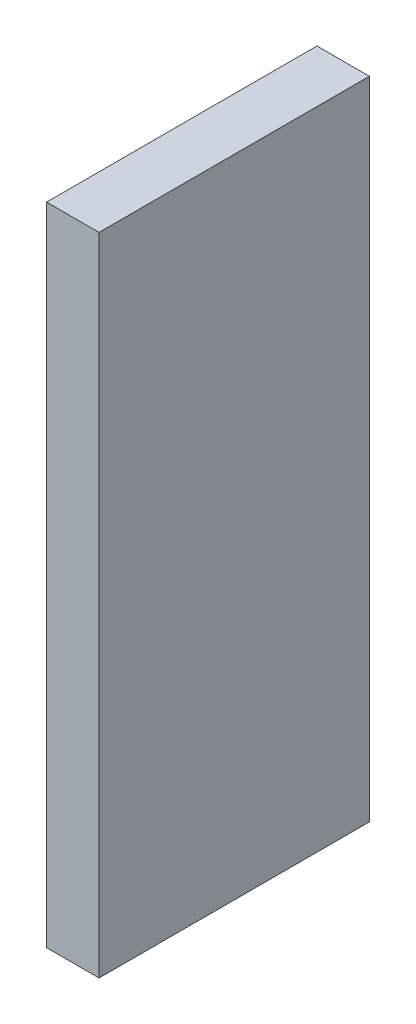
ISO-10303-21;
HEADER;
FILE_DESCRIPTION(('STEP AP214'),'2;1');
FILE_NAME('part.step','',(''),(''),'','','');
FILE_SCHEMA(('AUTOMOTIVE_DESIGN { 1 0 10303 214 1 1 1 1 }'));
ENDSEC;
DATA;
#1=APPLICATION_CONTEXT('core data for automotive mechanical design processes');
#2=APPLICATION_PROTOCOL_DEFINITION('international standard','automotive_design',2000,#1);
#3=PRODUCT_CONTEXT('',#1,'mechanical');
#4=PRODUCT('Part','Part','',(#3));
#5=PRODUCT_RELATED_PRODUCT_CATEGORY('part','',(#4));
#6=PRODUCT_DEFINITION_FORMATION('','',#4);
#7=PRODUCT_DEFINITION_CONTEXT('part definition',#1,'design');
#8=PRODUCT_DEFINITION('design','',#6,#7);
#9=PRODUCT_DEFINITION_SHAPE('','',#8);
#10=(LENGTH_UNIT() NAMED_UNIT(*) SI_UNIT(.MILLI.,.METRE.));
#11=(NAMED_UNIT(*) PLANE_ANGLE_UNIT() SI_UNIT($,.RADIAN.));
#12=(NAMED_UNIT(*) SI_UNIT($,.STERADIAN.) SOLID_ANGLE_UNIT());
#13=UNCERTAINTY_MEASURE_WITH_UNIT(LENGTH_MEASURE(1.E-05),#10,'distance_accuracy_value','');
#14=(GEOMETRIC_REPRESENTATION_CONTEXT(3) GLOBAL_UNCERTAINTY_ASSIGNED_CONTEXT((#13)) GLOBAL_UNIT_ASSIGNED_CONTEXT((#10,
#11,#12)) REPRESENTATION_CONTEXT('',''));
#15=CARTESIAN_POINT('',(0.,0.,0.));
#16=DIRECTION('',(0.,0.,1.));
#17=DIRECTION('',(1.,0.,0.));
#18=AXIS2_PLACEMENT_3D('',#15,#16,#17);
#19=CARTESIAN_POINT('',(-0.64983868,8.00050216,0.));
#20=DIRECTION('',(1.95433120833518E-06,0.99999999999809,0.));
#21=DIRECTION('',(0.,0.,-1.));
#22=AXIS2_PLACEMENT_3D('',#19,#20,#21);
#23=PLANE('',#22);
#24=DIRECTION('',(0.,0.,1.));
#25=VECTOR('',#24,1.);
#26=CARTESIAN_POINT('',(-0.64983868,8.00050216,0.));
#27=LINE('',#26,#25);
#28=CARTESIAN_POINT('',(-0.64983868,8.00050216,0.));
#29=VERTEX_POINT('',#28);
#30=CARTESIAN_POINT('',(-0.64983868,8.00050216,6.6999993));
#31=VERTEX_POINT('',#30);
#32=EDGE_CURVE('E11',#29,#31,#27,.T.);
#33=ORIENTED_EDGE('',*,*,#32,.T.);
#34=DIRECTION('',(0.99999999999809,-1.95433120833518E-06,0.));
#35=VECTOR('',#34,1.);
#36=CARTESIAN_POINT('',(-0.64983868,8.00050216,6.6999993));
#37=LINE('',#36,#35);
#38=CARTESIAN_POINT('',(0.64983868,8.00049962,6.6999993));
#39=VERTEX_POINT('',#38);
#40=EDGE_CURVE('E28',#31,#39,#37,.T.);
#41=ORIENTED_EDGE('',*,*,#40,.T.);
#42=DIRECTION('',(0.,0.,1.));
#43=VECTOR('',#42,1.);
#44=CARTESIAN_POINT('',(0.64983868,8.00049962,0.));
#45=LINE('',#44,#43);
#46=CARTESIAN_POINT('',(0.64983868,8.00049962,0.));
#47=VERTEX_POINT('',#46);
#48=EDGE_CURVE('E105',#47,#39,#45,.T.);
#49=ORIENTED_EDGE('',*,*,#48,.F.);
#50=DIRECTION('',(0.99999999999809,-1.95433120833518E-06,0.));
#51=VECTOR('',#50,1.);
#52=CARTESIAN_POINT('',(-0.64983868,8.00050216,0.));
#53=LINE('',#52,#51);
#54=EDGE_CURVE('E94',#29,#47,#53,.T.);
#55=ORIENTED_EDGE('',*,*,#54,.F.);
#56=EDGE_LOOP('',(#33,#41,#49,#55));
#57=FACE_BOUND('',#56,.T.);
#58=ADVANCED_FACE('F17',(#57),#23,.T.);
#59=CARTESIAN_POINT('',(0.64983868,8.00049962,0.));
#60=DIRECTION('',(1.,0.,0.));
#61=DIRECTION('',(0.,1.,0.));
#62=AXIS2_PLACEMENT_3D('',#59,#60,#61);
#63=PLANE('',#62);
#64=ORIENTED_EDGE('',*,*,#48,.T.);
#65=DIRECTION('',(0.,-1.,0.));
#66=VECTOR('',#65,1.);
#67=CARTESIAN_POINT('',(0.64983868,8.00049962,6.6999993));
#68=LINE('',#67,#66);
#69=CARTESIAN_POINT('',(0.64983868,-8.00049962,6.6999993));
#70=VERTEX_POINT('',#69);
#71=EDGE_CURVE('E103',#39,#70,#68,.T.);
#72=ORIENTED_EDGE('',*,*,#71,.T.);
#73=DIRECTION('',(0.,0.,1.));
#74=VECTOR('',#73,1.);
#75=CARTESIAN_POINT('',(0.64983868,-8.00049962,0.));
#76=LINE('',#75,#74);
#77=CARTESIAN_POINT('',(0.64983868,-8.00049962,0.));
#78=VERTEX_POINT('',#77);
#79=EDGE_CURVE('E21',#78,#70,#76,.T.);
#80=ORIENTED_EDGE('',*,*,#79,.F.);
#81=DIRECTION('',(0.,-1.,0.));
#82=VECTOR('',#81,1.);
#83=CARTESIAN_POINT('',(0.64983868,8.00049962,0.));
#84=LINE('',#83,#82);
#85=EDGE_CURVE('E99',#47,#78,#84,.T.);
#86=ORIENTED_EDGE('',*,*,#85,.F.);
#87=EDGE_LOOP('',(#64,#72,#80,#86));
#88=FACE_BOUND('',#87,.T.);
#89=ADVANCED_FACE('F123',(#88),#63,.T.);
#90=CARTESIAN_POINT('',(0.64983868,-8.00049962,0.));
#91=DIRECTION('',(-1.95583719379617E-06,-0.999999999998087,0.));
#92=DIRECTION('',(-0.999999999998087,1.95583719379617E-06,0.));
#93=AXIS2_PLACEMENT_3D('',#90,#91,#92);
#94=PLANE('',#93);
#95=ORIENTED_EDGE('',*,*,#79,.T.);
#96=DIRECTION('',(-0.999999999998087,1.95583719379617E-06,0.));
#97=VECTOR('',#96,1.);
#98=CARTESIAN_POINT('',(0.64983868,-8.00049962,6.6999993));
#99=LINE('',#98,#97);
#100=CARTESIAN_POINT('',(-0.64883792,-8.00049708,6.6999993));
#101=VERTEX_POINT('',#100);
#102=EDGE_CURVE('E84',#70,#101,#99,.T.);
#103=ORIENTED_EDGE('',*,*,#102,.T.);
#104=DIRECTION('',(0.,0.,1.));
#105=VECTOR('',#104,1.);
#106=CARTESIAN_POINT('',(-0.64883792,-8.00049708,0.));
#107=LINE('',#106,#105);
#108=CARTESIAN_POINT('',(-0.64883792,-8.00049708,0.));
#109=VERTEX_POINT('',#108);
#110=EDGE_CURVE('E76',#109,#101,#107,.T.);
#111=ORIENTED_EDGE('',*,*,#110,.F.);
#112=DIRECTION('',(-0.999999999998087,1.95583719379617E-06,0.));
#113=VECTOR('',#112,1.);
#114=CARTESIAN_POINT('',(0.64983868,-8.00049962,0.));
#115=LINE('',#114,#113);
#116=EDGE_CURVE('E67',#78,#109,#115,.T.);
#117=ORIENTED_EDGE('',*,*,#116,.F.);
#118=EDGE_LOOP('',(#95,#103,#111,#117));
#119=FACE_BOUND('',#118,.T.);
#120=ADVANCED_FACE('F87',(#119),#94,.T.);
#121=CARTESIAN_POINT('',(-0.64883792,-8.00049708,0.));
#122=DIRECTION('',(-0.999999998044149,-6.25435938745694E-05,0.));
#123=DIRECTION('',(-6.25435938745694E-05,0.999999998044149,0.));
#124=AXIS2_PLACEMENT_3D('',#121,#122,#123);
#125=PLANE('',#124);
#126=ORIENTED_EDGE('',*,*,#110,.T.);
#127=DIRECTION('',(-6.25435938745694E-05,0.999999998044149,0.));
#128=VECTOR('',#127,1.);
#129=CARTESIAN_POINT('',(-0.64883792,-8.00049708,6.6999993));
#130=LINE('',#129,#128);
#131=EDGE_CURVE('E80',#101,#31,#130,.T.);
#132=ORIENTED_EDGE('',*,*,#131,.T.);
#133=ORIENTED_EDGE('',*,*,#32,.F.);
#134=DIRECTION('',(-6.25435938745694E-05,0.999999998044149,0.));
#135=VECTOR('',#134,1.);
#136=CARTESIAN_POINT('',(-0.64883792,-8.00049708,0.));
#137=LINE('',#136,#135);
#138=EDGE_CURVE('E81',#109,#29,#137,.T.);
#139=ORIENTED_EDGE('',*,*,#138,.F.);
#140=EDGE_LOOP('',(#126,#132,#133,#139));
#141=FACE_BOUND('',#140,.T.);
#142=ADVANCED_FACE('F78',(#141),#125,.T.);
#143=CARTESIAN_POINT('',(-0.64983868,8.00050216,0.));
#144=DIRECTION('',(0.,0.,1.));
#145=DIRECTION('',(1.,0.,0.));
#146=AXIS2_PLACEMENT_3D('',#143,#144,#145);
#147=PLANE('',#146);
#148=ORIENTED_EDGE('',*,*,#54,.T.);
#149=ORIENTED_EDGE('',*,*,#85,.T.);
#150=ORIENTED_EDGE('',*,*,#116,.T.);
#151=ORIENTED_EDGE('',*,*,#138,.T.);
#152=EDGE_LOOP('',(#148,#149,#150,#151));
#153=FACE_BOUND('',#152,.T.);
#154=ADVANCED_FACE('F19',(#153),#147,.F.);
#155=CARTESIAN_POINT('',(-0.64983868,8.00050216,6.6999993));
#156=DIRECTION('',(0.,0.,1.));
#157=DIRECTION('',(1.,0.,0.));
#158=AXIS2_PLACEMENT_3D('',#155,#156,#157);
#159=PLANE('',#158);
#160=ORIENTED_EDGE('',*,*,#131,.F.);
#161=ORIENTED_EDGE('',*,*,#102,.F.);
#162=ORIENTED_EDGE('',*,*,#71,.F.);
#163=ORIENTED_EDGE('',*,*,#40,.F.);
#164=EDGE_LOOP('',(#160,#161,#162,#163));
#165=FACE_BOUND('',#164,.T.);
#166=ADVANCED_FACE('F92',(#165),#159,.T.);
#167=CLOSED_SHELL('',(#58,#89,#120,#142,#154,#166));
#168=MANIFOLD_SOLID_BREP('B1',#167);
#169=ADVANCED_BREP_SHAPE_REPRESENTATION('',(#18,#168),#14);
#170=SHAPE_DEFINITION_REPRESENTATION(#9,#169);
ENDSEC;
END-ISO-10303-21;
